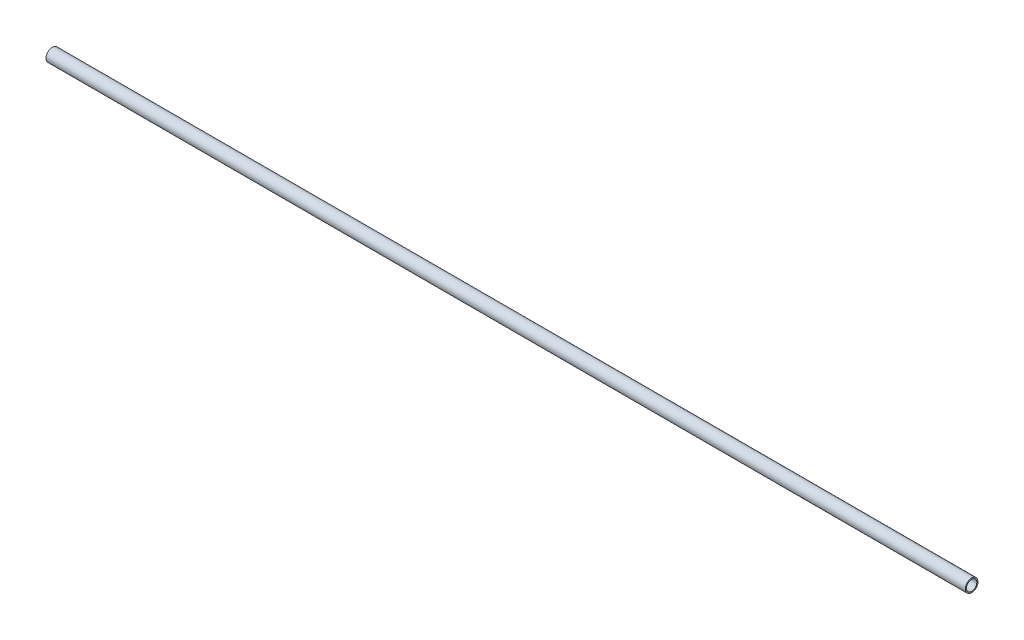
ISO-10303-21;
HEADER;
FILE_DESCRIPTION(('STEP AP214'),'2;1');
FILE_NAME('part.step','',(''),(''),'','','');
FILE_SCHEMA(('AUTOMOTIVE_DESIGN { 1 0 10303 214 1 1 1 1 }'));
ENDSEC;
DATA;
#1=APPLICATION_CONTEXT('core data for automotive mechanical design processes');
#2=APPLICATION_PROTOCOL_DEFINITION('international standard','automotive_design',2000,#1);
#3=PRODUCT_CONTEXT('',#1,'mechanical');
#4=PRODUCT('Part','Part','',(#3));
#5=PRODUCT_RELATED_PRODUCT_CATEGORY('part','',(#4));
#6=PRODUCT_DEFINITION_FORMATION('','',#4);
#7=PRODUCT_DEFINITION_CONTEXT('part definition',#1,'design');
#8=PRODUCT_DEFINITION('design','',#6,#7);
#9=PRODUCT_DEFINITION_SHAPE('','',#8);
#10=(LENGTH_UNIT() NAMED_UNIT(*) SI_UNIT(.MILLI.,.METRE.));
#11=(NAMED_UNIT(*) PLANE_ANGLE_UNIT() SI_UNIT($,.RADIAN.));
#12=(NAMED_UNIT(*) SI_UNIT($,.STERADIAN.) SOLID_ANGLE_UNIT());
#13=UNCERTAINTY_MEASURE_WITH_UNIT(LENGTH_MEASURE(1.E-05),#10,'distance_accuracy_value','');
#14=(GEOMETRIC_REPRESENTATION_CONTEXT(3) GLOBAL_UNCERTAINTY_ASSIGNED_CONTEXT((#13)) GLOBAL_UNIT_ASSIGNED_CONTEXT((#10,
#11,#12)) REPRESENTATION_CONTEXT('',''));
#15=CARTESIAN_POINT('',(0.,0.,0.));
#16=DIRECTION('',(0.,0.,1.));
#17=DIRECTION('',(1.,0.,0.));
#18=AXIS2_PLACEMENT_3D('',#15,#16,#17);
#19=CARTESIAN_POINT('',(1828.8,0.,0.));
#20=DIRECTION('',(1.,0.,0.));
#21=DIRECTION('',(0.,0.,-1.));
#22=AXIS2_PLACEMENT_3D('',#19,#20,#21);
#23=PLANE('',#22);
#24=CARTESIAN_POINT('',(1828.8,0.,0.));
#25=DIRECTION('',(1.,0.,0.));
#26=DIRECTION('',(0.,0.,-1.));
#27=AXIS2_PLACEMENT_3D('',#24,#25,#26);
#28=CIRCLE('',#27,12.7);
#29=CARTESIAN_POINT('',(1828.8,0.,12.7));
#30=VERTEX_POINT('',#29);
#31=EDGE_CURVE('E10',#30,#30,#28,.T.);
#32=ORIENTED_EDGE('',*,*,#31,.T.);
#33=EDGE_LOOP('',(#32));
#34=FACE_BOUND('',#33,.T.);
#35=CARTESIAN_POINT('',(1828.8,0.,0.));
#36=DIRECTION('',(1.,0.,0.));
#37=DIRECTION('',(0.,0.,-1.));
#38=AXIS2_PLACEMENT_3D('',#35,#36,#37);
#39=CIRCLE('',#38,10.287);
#40=CARTESIAN_POINT('',(1828.8,0.,10.287));
#41=VERTEX_POINT('',#40);
#42=EDGE_CURVE('E42',#41,#41,#39,.T.);
#43=ORIENTED_EDGE('',*,*,#42,.F.);
#44=EDGE_LOOP('',(#43));
#45=FACE_BOUND('',#44,.T.);
#46=ADVANCED_FACE('F31',(#34,#45),#23,.T.);
#47=CARTESIAN_POINT('',(0.,0.,0.));
#48=DIRECTION('',(1.,0.,0.));
#49=DIRECTION('',(0.,0.,-1.));
#50=AXIS2_PLACEMENT_3D('',#47,#48,#49);
#51=PLANE('',#50);
#52=CARTESIAN_POINT('',(0.,0.,0.));
#53=DIRECTION('',(1.,0.,0.));
#54=DIRECTION('',(0.,0.,-1.));
#55=AXIS2_PLACEMENT_3D('',#52,#53,#54);
#56=CIRCLE('',#55,12.7);
#57=CARTESIAN_POINT('',(-2.22044604925031E-13,0.,12.7));
#58=VERTEX_POINT('',#57);
#59=EDGE_CURVE('E35',#58,#58,#56,.T.);
#60=ORIENTED_EDGE('',*,*,#59,.F.);
#61=EDGE_LOOP('',(#60));
#62=FACE_BOUND('',#61,.T.);
#63=CARTESIAN_POINT('',(0.,0.,0.));
#64=DIRECTION('',(1.,0.,0.));
#65=DIRECTION('',(0.,0.,-1.));
#66=AXIS2_PLACEMENT_3D('',#63,#64,#65);
#67=CIRCLE('',#66,10.287);
#68=CARTESIAN_POINT('',(-2.22044604925031E-13,0.,10.287));
#69=VERTEX_POINT('',#68);
#70=EDGE_CURVE('E44',#69,#69,#67,.T.);
#71=ORIENTED_EDGE('',*,*,#70,.T.);
#72=EDGE_LOOP('',(#71));
#73=FACE_BOUND('',#72,.T.);
#74=ADVANCED_FACE('F54',(#62,#73),#51,.F.);
#75=CARTESIAN_POINT('',(1828.8,0.,0.));
#76=DIRECTION('',(-1.,0.,0.));
#77=DIRECTION('',(0.,0.,1.));
#78=AXIS2_PLACEMENT_3D('',#75,#76,#77);
#79=CYLINDRICAL_SURFACE('',#78,12.7);
#80=CARTESIAN_POINT('',(1828.8,0.,12.7));
#81=CARTESIAN_POINT('',(1809.75,0.,12.7));
#82=CARTESIAN_POINT('',(1790.7,0.,12.7));
#83=CARTESIAN_POINT('',(1752.6,0.,12.7));
#84=CARTESIAN_POINT('',(1733.55,0.,12.7));
#85=CARTESIAN_POINT('',(1695.45,0.,12.7));
#86=CARTESIAN_POINT('',(1676.4,0.,12.7));
#87=CARTESIAN_POINT('',(1638.3,0.,12.7));
#88=CARTESIAN_POINT('',(1619.25,0.,12.7));
#89=CARTESIAN_POINT('',(1581.15,0.,12.7));
#90=CARTESIAN_POINT('',(1562.1,0.,12.7));
#91=CARTESIAN_POINT('',(1524.,0.,12.7));
#92=CARTESIAN_POINT('',(1504.95,0.,12.7));
#93=CARTESIAN_POINT('',(1466.85,0.,12.7));
#94=CARTESIAN_POINT('',(1447.8,0.,12.7));
#95=CARTESIAN_POINT('',(1409.7,0.,12.7));
#96=CARTESIAN_POINT('',(1390.65,0.,12.7));
#97=CARTESIAN_POINT('',(1352.55,0.,12.7));
#98=CARTESIAN_POINT('',(1333.5,0.,12.7));
#99=CARTESIAN_POINT('',(1295.4,0.,12.7));
#100=CARTESIAN_POINT('',(1276.35,0.,12.7));
#101=CARTESIAN_POINT('',(1238.25,0.,12.7));
#102=CARTESIAN_POINT('',(1219.2,0.,12.7));
#103=CARTESIAN_POINT('',(1181.1,0.,12.7));
#104=CARTESIAN_POINT('',(1162.05,0.,12.7));
#105=CARTESIAN_POINT('',(1123.95,0.,12.7));
#106=CARTESIAN_POINT('',(1104.9,0.,12.7));
#107=CARTESIAN_POINT('',(1066.8,0.,12.7));
#108=CARTESIAN_POINT('',(1047.75,0.,12.7));
#109=CARTESIAN_POINT('',(1009.65,0.,12.7));
#110=CARTESIAN_POINT('',(990.6,0.,12.7));
#111=CARTESIAN_POINT('',(952.5,0.,12.7));
#112=CARTESIAN_POINT('',(933.45,0.,12.7));
#113=CARTESIAN_POINT('',(895.35,0.,12.7));
#114=CARTESIAN_POINT('',(876.3,0.,12.7));
#115=CARTESIAN_POINT('',(838.2,0.,12.7));
#116=CARTESIAN_POINT('',(819.15,0.,12.7));
#117=CARTESIAN_POINT('',(781.05,0.,12.7));
#118=CARTESIAN_POINT('',(762.,0.,12.7));
#119=CARTESIAN_POINT('',(723.9,0.,12.7));
#120=CARTESIAN_POINT('',(704.85,0.,12.7));
#121=CARTESIAN_POINT('',(666.75,0.,12.7));
#122=CARTESIAN_POINT('',(647.7,0.,12.7));
#123=CARTESIAN_POINT('',(609.6,0.,12.7));
#124=CARTESIAN_POINT('',(590.55,0.,12.7));
#125=CARTESIAN_POINT('',(552.45,0.,12.7));
#126=CARTESIAN_POINT('',(533.4,0.,12.7));
#127=CARTESIAN_POINT('',(495.3,0.,12.7));
#128=CARTESIAN_POINT('',(476.25,0.,12.7));
#129=CARTESIAN_POINT('',(438.15,0.,12.7));
#130=CARTESIAN_POINT('',(419.1,0.,12.7));
#131=CARTESIAN_POINT('',(381.,0.,12.7));
#132=CARTESIAN_POINT('',(361.95,0.,12.7));
#133=CARTESIAN_POINT('',(323.85,0.,12.7));
#134=CARTESIAN_POINT('',(304.8,0.,12.7));
#135=CARTESIAN_POINT('',(266.7,0.,12.7));
#136=CARTESIAN_POINT('',(247.65,0.,12.7));
#137=CARTESIAN_POINT('',(209.55,0.,12.7));
#138=CARTESIAN_POINT('',(190.5,0.,12.7));
#139=CARTESIAN_POINT('',(152.4,0.,12.7));
#140=CARTESIAN_POINT('',(133.35,0.,12.7));
#141=CARTESIAN_POINT('',(95.2499999999998,0.,12.7));
#142=CARTESIAN_POINT('',(76.1999999999998,0.,12.7));
#143=CARTESIAN_POINT('',(38.0999999999998,0.,12.7));
#144=CARTESIAN_POINT('',(19.0499999999998,0.,12.7));
#145=CARTESIAN_POINT('',(-2.22044604925031E-13,0.,12.7));
#146=B_SPLINE_CURVE_WITH_KNOTS('',3,(#80,#81,#82,#83,#84,#85,#86,#87,#88,#89,#90,#91,#92,#93,
#94,#95,#96,#97,#98,#99,#100,#101,#102,#103,#104,#105,#106,#107,#108,#109,#110,#111,#112,#113,
#114,#115,#116,#117,#118,#119,#120,#121,#122,#123,#124,#125,#126,#127,#128,#129,#130,#131,#132,
#133,#134,#135,#136,#137,#138,#139,#140,#141,#142,#143,#144,#145),.UNSPECIFIED.,.F.,.F.,(4,2,2,
2,2,2,2,2,2,2,2,2,2,2,2,2,2,2,2,2,2,2,2,2,2,2,2,2,2,2,2,2,4),(0.,57.15,114.3,171.45,228.6,
285.75,342.9,400.05,457.2,514.35,571.5,628.65,685.8,742.95,800.1,857.25,914.4,971.55,1028.7,
1085.85,1143.,1200.15,1257.3,1314.45,1371.6,1428.75,1485.9,1543.05,1600.2,1657.35,1714.5,
1771.65,1828.8),.UNSPECIFIED.);
#147=EDGE_CURVE('BSEAM33',#30,#58,#146,.T.);
#148=ORIENTED_EDGE('',*,*,#31,.F.);
#149=ORIENTED_EDGE('',*,*,#59,.T.);
#150=ORIENTED_EDGE('',*,*,#147,.T.);
#151=ORIENTED_EDGE('',*,*,#147,.F.);
#152=EDGE_LOOP('',(#148,#150,#149,#151));
#153=FACE_BOUND('',#152,.T.);
#154=ADVANCED_FACE('F33',(#153),#79,.T.);
#155=CARTESIAN_POINT('',(1828.8,0.,0.));
#156=DIRECTION('',(-1.,0.,0.));
#157=DIRECTION('',(0.,0.,1.));
#158=AXIS2_PLACEMENT_3D('',#155,#156,#157);
#159=CYLINDRICAL_SURFACE('',#158,10.287);
#160=CARTESIAN_POINT('',(1828.8,0.,10.287));
#161=CARTESIAN_POINT('',(1809.75,0.,10.287));
#162=CARTESIAN_POINT('',(1790.7,0.,10.287));
#163=CARTESIAN_POINT('',(1752.6,0.,10.287));
#164=CARTESIAN_POINT('',(1733.55,0.,10.287));
#165=CARTESIAN_POINT('',(1695.45,0.,10.287));
#166=CARTESIAN_POINT('',(1676.4,0.,10.287));
#167=CARTESIAN_POINT('',(1638.3,0.,10.287));
#168=CARTESIAN_POINT('',(1619.25,0.,10.287));
#169=CARTESIAN_POINT('',(1581.15,0.,10.287));
#170=CARTESIAN_POINT('',(1562.1,0.,10.287));
#171=CARTESIAN_POINT('',(1524.,0.,10.287));
#172=CARTESIAN_POINT('',(1504.95,0.,10.287));
#173=CARTESIAN_POINT('',(1466.85,0.,10.287));
#174=CARTESIAN_POINT('',(1447.8,0.,10.287));
#175=CARTESIAN_POINT('',(1409.7,0.,10.287));
#176=CARTESIAN_POINT('',(1390.65,0.,10.287));
#177=CARTESIAN_POINT('',(1352.55,0.,10.287));
#178=CARTESIAN_POINT('',(1333.5,0.,10.287));
#179=CARTESIAN_POINT('',(1295.4,0.,10.287));
#180=CARTESIAN_POINT('',(1276.35,0.,10.287));
#181=CARTESIAN_POINT('',(1238.25,0.,10.287));
#182=CARTESIAN_POINT('',(1219.2,0.,10.287));
#183=CARTESIAN_POINT('',(1181.1,0.,10.287));
#184=CARTESIAN_POINT('',(1162.05,0.,10.287));
#185=CARTESIAN_POINT('',(1123.95,0.,10.287));
#186=CARTESIAN_POINT('',(1104.9,0.,10.287));
#187=CARTESIAN_POINT('',(1066.8,0.,10.287));
#188=CARTESIAN_POINT('',(1047.75,0.,10.287));
#189=CARTESIAN_POINT('',(1009.65,0.,10.287));
#190=CARTESIAN_POINT('',(990.6,0.,10.287));
#191=CARTESIAN_POINT('',(952.5,0.,10.287));
#192=CARTESIAN_POINT('',(933.45,0.,10.287));
#193=CARTESIAN_POINT('',(895.35,0.,10.287));
#194=CARTESIAN_POINT('',(876.3,0.,10.287));
#195=CARTESIAN_POINT('',(838.2,0.,10.287));
#196=CARTESIAN_POINT('',(819.15,0.,10.287));
#197=CARTESIAN_POINT('',(781.05,0.,10.287));
#198=CARTESIAN_POINT('',(762.,0.,10.287));
#199=CARTESIAN_POINT('',(723.9,0.,10.287));
#200=CARTESIAN_POINT('',(704.85,0.,10.287));
#201=CARTESIAN_POINT('',(666.75,0.,10.287));
#202=CARTESIAN_POINT('',(647.7,0.,10.287));
#203=CARTESIAN_POINT('',(609.6,0.,10.287));
#204=CARTESIAN_POINT('',(590.55,0.,10.287));
#205=CARTESIAN_POINT('',(552.45,0.,10.287));
#206=CARTESIAN_POINT('',(533.4,0.,10.287));
#207=CARTESIAN_POINT('',(495.3,0.,10.287));
#208=CARTESIAN_POINT('',(476.25,0.,10.287));
#209=CARTESIAN_POINT('',(438.15,0.,10.287));
#210=CARTESIAN_POINT('',(419.1,0.,10.287));
#211=CARTESIAN_POINT('',(381.,0.,10.287));
#212=CARTESIAN_POINT('',(361.95,0.,10.287));
#213=CARTESIAN_POINT('',(323.85,0.,10.287));
#214=CARTESIAN_POINT('',(304.8,0.,10.287));
#215=CARTESIAN_POINT('',(266.7,0.,10.287));
#216=CARTESIAN_POINT('',(247.65,0.,10.287));
#217=CARTESIAN_POINT('',(209.55,0.,10.287));
#218=CARTESIAN_POINT('',(190.5,0.,10.287));
#219=CARTESIAN_POINT('',(152.4,0.,10.287));
#220=CARTESIAN_POINT('',(133.35,0.,10.287));
#221=CARTESIAN_POINT('',(95.2499999999998,0.,10.287));
#222=CARTESIAN_POINT('',(76.1999999999998,0.,10.287));
#223=CARTESIAN_POINT('',(38.0999999999998,0.,10.287));
#224=CARTESIAN_POINT('',(19.0499999999998,0.,10.287));
#225=CARTESIAN_POINT('',(-2.22044604925031E-13,0.,10.287));
#226=B_SPLINE_CURVE_WITH_KNOTS('',3,(#160,#161,#162,#163,#164,#165,#166,#167,#168,#169,#170,
#171,#172,#173,#174,#175,#176,#177,#178,#179,#180,#181,#182,#183,#184,#185,#186,#187,#188,#189,
#190,#191,#192,#193,#194,#195,#196,#197,#198,#199,#200,#201,#202,#203,#204,#205,#206,#207,#208,
#209,#210,#211,#212,#213,#214,#215,#216,#217,#218,#219,#220,#221,#222,#223,#224,#225),
.UNSPECIFIED.,.F.,.F.,(4,2,2,2,2,2,2,2,2,2,2,2,2,2,2,2,2,2,2,2,2,2,2,2,2,2,2,2,2,2,2,2,4),(0.,
57.15,114.3,171.45,228.6,285.75,342.9,400.05,457.2,514.35,571.5,628.65,685.8,742.95,800.1,
857.25,914.4,971.55,1028.7,1085.85,1143.,1200.15,1257.3,1314.45,1371.6,1428.75,1485.9,1543.05,
1600.2,1657.35,1714.5,1771.65,1828.8),.UNSPECIFIED.);
#227=EDGE_CURVE('BSEAM50',#41,#69,#226,.T.);
#228=ORIENTED_EDGE('',*,*,#42,.T.);
#229=ORIENTED_EDGE('',*,*,#70,.F.);
#230=ORIENTED_EDGE('',*,*,#227,.T.);
#231=ORIENTED_EDGE('',*,*,#227,.F.);
#232=EDGE_LOOP('',(#228,#230,#229,#231));
#233=FACE_BOUND('',#232,.T.);
#234=ADVANCED_FACE('F50',(#233),#159,.F.);
#235=CLOSED_SHELL('',(#46,#74,#154,#234));
#236=MANIFOLD_SOLID_BREP('B2',#235);
#237=ADVANCED_BREP_SHAPE_REPRESENTATION('',(#18,#236),#14);
#238=SHAPE_DEFINITION_REPRESENTATION(#9,#237);
ENDSEC;
END-ISO-10303-21;
